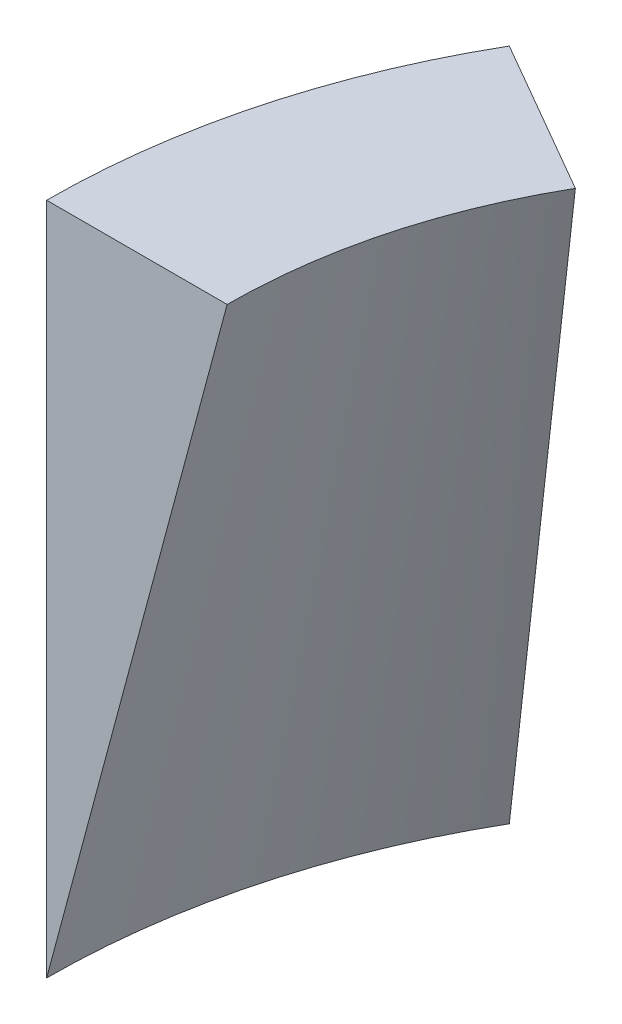
ISO-10303-21;
HEADER;
FILE_DESCRIPTION(('STEP AP214'),'2;1');
FILE_NAME('part.step','',(''),(''),'','','');
FILE_SCHEMA(('AUTOMOTIVE_DESIGN { 1 0 10303 214 1 1 1 1 }'));
ENDSEC;
DATA;
#1=APPLICATION_CONTEXT('core data for automotive mechanical design processes');
#2=APPLICATION_PROTOCOL_DEFINITION('international standard','automotive_design',2000,#1);
#3=PRODUCT_CONTEXT('',#1,'mechanical');
#4=PRODUCT('Part','Part','',(#3));
#5=PRODUCT_RELATED_PRODUCT_CATEGORY('part','',(#4));
#6=PRODUCT_DEFINITION_FORMATION('','',#4);
#7=PRODUCT_DEFINITION_CONTEXT('part definition',#1,'design');
#8=PRODUCT_DEFINITION('design','',#6,#7);
#9=PRODUCT_DEFINITION_SHAPE('','',#8);
#10=(LENGTH_UNIT() NAMED_UNIT(*) SI_UNIT(.MILLI.,.METRE.));
#11=(NAMED_UNIT(*) PLANE_ANGLE_UNIT() SI_UNIT($,.RADIAN.));
#12=(NAMED_UNIT(*) SI_UNIT($,.STERADIAN.) SOLID_ANGLE_UNIT());
#13=UNCERTAINTY_MEASURE_WITH_UNIT(LENGTH_MEASURE(1.E-05),#10,'distance_accuracy_value','');
#14=(GEOMETRIC_REPRESENTATION_CONTEXT(3) GLOBAL_UNCERTAINTY_ASSIGNED_CONTEXT((#13)) GLOBAL_UNIT_ASSIGNED_CONTEXT((#10,
#11,#12)) REPRESENTATION_CONTEXT('',''));
#15=CARTESIAN_POINT('',(0.,0.,0.));
#16=DIRECTION('',(0.,0.,1.));
#17=DIRECTION('',(1.,0.,0.));
#18=AXIS2_PLACEMENT_3D('',#15,#16,#17);
#19=CARTESIAN_POINT('',(7.63939010773876,7.05129987739928,0.));
#20=DIRECTION('',(0.,1.,0.));
#21=DIRECTION('',(-1.,0.,0.));
#22=AXIS2_PLACEMENT_3D('',#19,#20,#21);
#23=CYLINDRICAL_SURFACE('',#22,7.63939010773876);
#24=CARTESIAN_POINT('',(7.63939010773876,7.05129987739928,0.));
#25=DIRECTION('',(0.,1.,0.));
#26=DIRECTION('',(-1.,0.,0.));
#27=AXIS2_PLACEMENT_3D('',#24,#25,#26);
#28=CIRCLE('',#27,7.63939010773875);
#29=CARTESIAN_POINT('',(1.02348420501746,7.05129987739928,-3.81969505386939));
#30=VERTEX_POINT('',#29);
#31=CARTESIAN_POINT('',(0.,7.05129987739928,0.));
#32=VERTEX_POINT('',#31);
#33=EDGE_CURVE('E11',#30,#32,#28,.T.);
#34=ORIENTED_EDGE('',*,*,#33,.F.);
#35=DIRECTION('',(0.,-1.,0.));
#36=VECTOR('',#35,1.);
#37=CARTESIAN_POINT('',(1.02348420501746,7.05129987739928,-3.81969505386939));
#38=LINE('',#37,#36);
#39=CARTESIAN_POINT('',(1.02348420501746,0.,-3.81969505386939));
#40=VERTEX_POINT('',#39);
#41=EDGE_CURVE('E81',#30,#40,#38,.T.);
#42=ORIENTED_EDGE('',*,*,#41,.T.);
#43=CARTESIAN_POINT('',(7.63939010773876,0.,0.));
#44=DIRECTION('',(0.,1.,0.));
#45=DIRECTION('',(-1.,0.,0.));
#46=AXIS2_PLACEMENT_3D('',#43,#44,#45);
#47=CIRCLE('',#46,7.63939010773876);
#48=CARTESIAN_POINT('',(0.,0.,0.));
#49=VERTEX_POINT('',#48);
#50=EDGE_CURVE('E76',#40,#49,#47,.T.);
#51=ORIENTED_EDGE('',*,*,#50,.T.);
#52=DIRECTION('',(0.,-1.,0.));
#53=VECTOR('',#52,1.);
#54=CARTESIAN_POINT('',(0.,7.05129987739928,0.));
#55=LINE('',#54,#53);
#56=EDGE_CURVE('E79',#32,#49,#55,.T.);
#57=ORIENTED_EDGE('',*,*,#56,.F.);
#58=EDGE_LOOP('',(#34,#42,#51,#57));
#59=FACE_BOUND('',#58,.T.);
#60=ADVANCED_FACE('F45',(#59),#23,.T.);
#61=CARTESIAN_POINT('',(2.65974403597824,7.05129987739928,-2.87500000000001));
#62=DIRECTION('',(0.,1.,0.));
#63=DIRECTION('',(-1.,0.,0.));
#64=AXIS2_PLACEMENT_3D('',#61,#62,#63);
#65=PLANE('',#64);
#66=CARTESIAN_POINT('',(7.63939010773876,7.05129987739928,0.));
#67=DIRECTION('',(0.,1.,0.));
#68=DIRECTION('',(-1.,0.,0.));
#69=AXIS2_PLACEMENT_3D('',#66,#67,#68);
#70=CIRCLE('',#69,5.75);
#71=CARTESIAN_POINT('',(2.65974403597824,7.05129987739928,-2.87500000000001));
#72=VERTEX_POINT('',#71);
#73=CARTESIAN_POINT('',(1.88939010773876,7.05129987739928,0.));
#74=VERTEX_POINT('',#73);
#75=EDGE_CURVE('E54',#72,#74,#70,.T.);
#76=ORIENTED_EDGE('',*,*,#75,.F.);
#77=DIRECTION('',(-0.866025403784438,0.,-0.500000000000001));
#78=VECTOR('',#77,1.);
#79=CARTESIAN_POINT('',(2.65974403597824,7.05129987739928,-2.87500000000001));
#80=LINE('',#79,#78);
#81=EDGE_CURVE('E85',#72,#30,#80,.T.);
#82=ORIENTED_EDGE('',*,*,#81,.T.);
#83=ORIENTED_EDGE('',*,*,#33,.T.);
#84=DIRECTION('',(-1.,0.,0.));
#85=VECTOR('',#84,1.);
#86=CARTESIAN_POINT('',(1.88939010773876,7.05129987739928,0.));
#87=LINE('',#86,#85);
#88=EDGE_CURVE('E93',#74,#32,#87,.T.);
#89=ORIENTED_EDGE('',*,*,#88,.F.);
#90=EDGE_LOOP('',(#76,#82,#83,#89));
#91=FACE_BOUND('',#90,.T.);
#92=ADVANCED_FACE('F47',(#91),#65,.T.);
#93=CARTESIAN_POINT('',(7.63939010773876,0.,0.));
#94=DIRECTION('',(0.,-1.,0.));
#95=DIRECTION('',(1.,0.,0.));
#96=AXIS2_PLACEMENT_3D('',#93,#94,#95);
#97=CONICAL_SURFACE('',#96,7.63939010773876,0.261799387799143);
#98=DIRECTION('',(0.224143868042007,0.96592582628907,0.129409522551257));
#99=VECTOR('',#98,1.);
#100=CARTESIAN_POINT('',(1.02348420501746,0.,-3.81969505386939));
#101=LINE('',#100,#99);
#102=EDGE_CURVE('E103',#40,#72,#101,.T.);
#103=ORIENTED_EDGE('',*,*,#102,.T.);
#104=ORIENTED_EDGE('',*,*,#75,.T.);
#105=DIRECTION('',(0.258819045102514,0.96592582628907,0.));
#106=VECTOR('',#105,1.);
#107=CARTESIAN_POINT('',(0.,0.,0.));
#108=LINE('',#107,#106);
#109=EDGE_CURVE('E88',#49,#74,#108,.T.);
#110=ORIENTED_EDGE('',*,*,#109,.F.);
#111=ORIENTED_EDGE('',*,*,#50,.F.);
#112=EDGE_LOOP('',(#103,#104,#110,#111));
#113=FACE_BOUND('',#112,.T.);
#114=ADVANCED_FACE('F89',(#113),#97,.F.);
#115=CARTESIAN_POINT('',(1.02348420501746,0.,-3.81969505386939));
#116=DIRECTION('',(0.500000000000001,0.,-0.866025403784438));
#117=DIRECTION('',(-0.866025403784438,0.,-0.500000000000001));
#118=AXIS2_PLACEMENT_3D('',#115,#116,#117);
#119=PLANE('',#118);
#120=ORIENTED_EDGE('',*,*,#41,.F.);
#121=ORIENTED_EDGE('',*,*,#81,.F.);
#122=ORIENTED_EDGE('',*,*,#102,.F.);
#123=EDGE_LOOP('',(#120,#121,#122));
#124=FACE_BOUND('',#123,.T.);
#125=ADVANCED_FACE('F110',(#124),#119,.T.);
#126=CARTESIAN_POINT('',(0.,0.,0.));
#127=DIRECTION('',(0.,0.,-1.));
#128=DIRECTION('',(-1.,0.,0.));
#129=AXIS2_PLACEMENT_3D('',#126,#127,#128);
#130=PLANE('',#129);
#131=ORIENTED_EDGE('',*,*,#56,.T.);
#132=ORIENTED_EDGE('',*,*,#109,.T.);
#133=ORIENTED_EDGE('',*,*,#88,.T.);
#134=EDGE_LOOP('',(#131,#132,#133));
#135=FACE_BOUND('',#134,.T.);
#136=ADVANCED_FACE('F95',(#135),#130,.F.);
#137=CLOSED_SHELL('',(#60,#92,#114,#125,#136));
#138=MANIFOLD_SOLID_BREP('B2',#137);
#139=ADVANCED_BREP_SHAPE_REPRESENTATION('',(#18,#138),#14);
#140=SHAPE_DEFINITION_REPRESENTATION(#9,#139);
ENDSEC;
END-ISO-10303-21;
